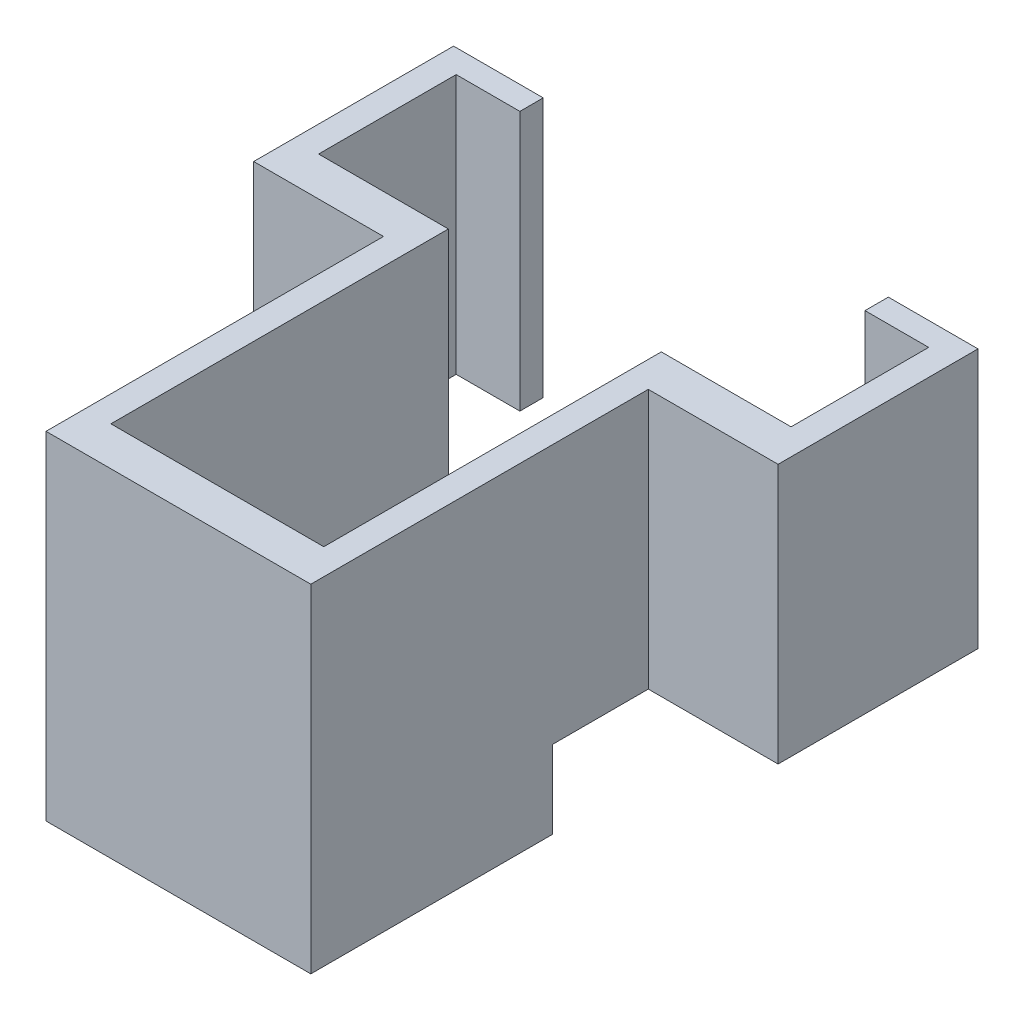
ISO-10303-21;
HEADER;
FILE_DESCRIPTION(('STEP AP214'),'2;1');
FILE_NAME('part.step','',(''),(''),'','','');
FILE_SCHEMA(('AUTOMOTIVE_DESIGN { 1 0 10303 214 1 1 1 1 }'));
ENDSEC;
DATA;
#1=APPLICATION_CONTEXT('core data for automotive mechanical design processes');
#2=APPLICATION_PROTOCOL_DEFINITION('international standard','automotive_design',2000,#1);
#3=PRODUCT_CONTEXT('',#1,'mechanical');
#4=PRODUCT('Part','Part','',(#3));
#5=PRODUCT_RELATED_PRODUCT_CATEGORY('part','',(#4));
#6=PRODUCT_DEFINITION_FORMATION('','',#4);
#7=PRODUCT_DEFINITION_CONTEXT('part definition',#1,'design');
#8=PRODUCT_DEFINITION('design','',#6,#7);
#9=PRODUCT_DEFINITION_SHAPE('','',#8);
#10=(LENGTH_UNIT() NAMED_UNIT(*) SI_UNIT(.MILLI.,.METRE.));
#11=(NAMED_UNIT(*) PLANE_ANGLE_UNIT() SI_UNIT($,.RADIAN.));
#12=(NAMED_UNIT(*) SI_UNIT($,.STERADIAN.) SOLID_ANGLE_UNIT());
#13=UNCERTAINTY_MEASURE_WITH_UNIT(LENGTH_MEASURE(1.E-05),#10,'distance_accuracy_value','');
#14=(GEOMETRIC_REPRESENTATION_CONTEXT(3) GLOBAL_UNCERTAINTY_ASSIGNED_CONTEXT((#13)) GLOBAL_UNIT_ASSIGNED_CONTEXT((#10,
#11,#12)) REPRESENTATION_CONTEXT('',''));
#15=CARTESIAN_POINT('',(0.,0.,0.));
#16=DIRECTION('',(0.,0.,1.));
#17=DIRECTION('',(1.,0.,0.));
#18=AXIS2_PLACEMENT_3D('',#15,#16,#17);
#19=CARTESIAN_POINT('',(-13.2931043324018,13.,0.));
#20=DIRECTION('',(0.,0.,-1.));
#21=DIRECTION('',(-1.,0.,0.));
#22=AXIS2_PLACEMENT_3D('',#19,#20,#21);
#23=PLANE('',#22);
#24=DIRECTION('',(0.,-1.,0.));
#25=VECTOR('',#24,1.);
#26=CARTESIAN_POINT('',(-15.7465521662009,13.,0.));
#27=LINE('',#26,#25);
#28=CARTESIAN_POINT('',(-15.7465521662009,13.,0.));
#29=VERTEX_POINT('',#28);
#30=CARTESIAN_POINT('',(-15.7465521662009,3.,0.));
#31=VERTEX_POINT('',#30);
#32=EDGE_CURVE('E310',#29,#31,#27,.T.);
#33=ORIENTED_EDGE('',*,*,#32,.T.);
#34=DIRECTION('',(1.,0.,0.));
#35=VECTOR('',#34,1.);
#36=CARTESIAN_POINT('',(-13.2931043324018,3.,0.));
#37=LINE('',#36,#35);
#38=CARTESIAN_POINT('',(-13.2931043324018,3.,0.));
#39=VERTEX_POINT('',#38);
#40=EDGE_CURVE('E472',#31,#39,#37,.T.);
#41=ORIENTED_EDGE('',*,*,#40,.T.);
#42=DIRECTION('',(0.,-1.,0.));
#43=VECTOR('',#42,1.);
#44=CARTESIAN_POINT('',(-13.2931043324018,13.,0.));
#45=LINE('',#44,#43);
#46=CARTESIAN_POINT('',(-13.2931043324018,13.,0.));
#47=VERTEX_POINT('',#46);
#48=EDGE_CURVE('E271',#47,#39,#45,.T.);
#49=ORIENTED_EDGE('',*,*,#48,.F.);
#50=DIRECTION('',(1.,0.,0.));
#51=VECTOR('',#50,1.);
#52=CARTESIAN_POINT('',(-13.2931043324018,13.,0.));
#53=LINE('',#52,#51);
#54=EDGE_CURVE('E298',#29,#47,#53,.T.);
#55=ORIENTED_EDGE('',*,*,#54,.F.);
#56=EDGE_LOOP('',(#33,#41,#49,#55));
#57=FACE_BOUND('',#56,.T.);
#58=ADVANCED_FACE('F42',(#57),#23,.F.);
#59=CARTESIAN_POINT('',(-13.2931043324018,13.,-0.899999999999998));
#60=DIRECTION('',(-1.,0.,0.));
#61=DIRECTION('',(0.,0.,1.));
#62=AXIS2_PLACEMENT_3D('',#59,#60,#61);
#63=PLANE('',#62);
#64=ORIENTED_EDGE('',*,*,#48,.T.);
#65=DIRECTION('',(0.,0.,-1.));
#66=VECTOR('',#65,1.);
#67=CARTESIAN_POINT('',(-13.2931043324018,3.,-0.899999999999998));
#68=LINE('',#67,#66);
#69=CARTESIAN_POINT('',(-13.2931043324018,3.,-0.899999999999998));
#70=VERTEX_POINT('',#69);
#71=EDGE_CURVE('E466',#39,#70,#68,.T.);
#72=ORIENTED_EDGE('',*,*,#71,.T.);
#73=DIRECTION('',(0.,-1.,0.));
#74=VECTOR('',#73,1.);
#75=CARTESIAN_POINT('',(-13.2931043324018,13.,-0.899999999999998));
#76=LINE('',#75,#74);
#77=CARTESIAN_POINT('',(-13.2931043324018,13.,-0.899999999999998));
#78=VERTEX_POINT('',#77);
#79=EDGE_CURVE('E267',#78,#70,#76,.T.);
#80=ORIENTED_EDGE('',*,*,#79,.F.);
#81=DIRECTION('',(0.,0.,-1.));
#82=VECTOR('',#81,1.);
#83=CARTESIAN_POINT('',(-13.2931043324018,13.,-0.899999999999998));
#84=LINE('',#83,#82);
#85=EDGE_CURVE('E304',#47,#78,#84,.T.);
#86=ORIENTED_EDGE('',*,*,#85,.F.);
#87=EDGE_LOOP('',(#64,#72,#80,#86));
#88=FACE_BOUND('',#87,.T.);
#89=ADVANCED_FACE('F513',(#88),#63,.F.);
#90=CARTESIAN_POINT('',(-13.2931043324018,13.,-0.899999999999998));
#91=DIRECTION('',(0.,0.,1.));
#92=DIRECTION('',(1.,0.,0.));
#93=AXIS2_PLACEMENT_3D('',#90,#91,#92);
#94=PLANE('',#93);
#95=ORIENTED_EDGE('',*,*,#79,.T.);
#96=DIRECTION('',(-1.,0.,0.));
#97=VECTOR('',#96,1.);
#98=CARTESIAN_POINT('',(3.45344783379909,3.,-0.899999999999998));
#99=LINE('',#98,#97);
#100=CARTESIAN_POINT('',(-16.7465521662009,3.,-0.899999999999998));
#101=VERTEX_POINT('',#100);
#102=EDGE_CURVE('E217',#70,#101,#99,.T.);
#103=ORIENTED_EDGE('',*,*,#102,.T.);
#104=DIRECTION('',(0.,-1.,0.));
#105=VECTOR('',#104,1.);
#106=CARTESIAN_POINT('',(-16.7465521662009,13.,-0.899999999999998));
#107=LINE('',#106,#105);
#108=CARTESIAN_POINT('',(-16.7465521662009,13.,-0.899999999999998));
#109=VERTEX_POINT('',#108);
#110=EDGE_CURVE('E263',#109,#101,#107,.T.);
#111=ORIENTED_EDGE('',*,*,#110,.F.);
#112=DIRECTION('',(-1.,0.,0.));
#113=VECTOR('',#112,1.);
#114=CARTESIAN_POINT('',(-13.2931043324018,13.,-0.899999999999998));
#115=LINE('',#114,#113);
#116=EDGE_CURVE('E382',#78,#109,#115,.T.);
#117=ORIENTED_EDGE('',*,*,#116,.F.);
#118=EDGE_LOOP('',(#95,#103,#111,#117));
#119=FACE_BOUND('',#118,.T.);
#120=ADVANCED_FACE('F501',(#119),#94,.F.);
#121=CARTESIAN_POINT('',(-16.7465521662009,13.,-0.899999999999998));
#122=DIRECTION('',(1.,0.,0.));
#123=DIRECTION('',(0.,0.,-1.));
#124=AXIS2_PLACEMENT_3D('',#121,#122,#123);
#125=PLANE('',#124);
#126=ORIENTED_EDGE('',*,*,#110,.T.);
#127=DIRECTION('',(0.,0.,1.));
#128=VECTOR('',#127,1.);
#129=CARTESIAN_POINT('',(-16.7465521662009,3.,-0.899999999999998));
#130=LINE('',#129,#128);
#131=CARTESIAN_POINT('',(-16.7465521662009,3.,6.8));
#132=VERTEX_POINT('',#131);
#133=EDGE_CURVE('E376',#101,#132,#130,.T.);
#134=ORIENTED_EDGE('',*,*,#133,.T.);
#135=DIRECTION('',(0.,-1.,0.));
#136=VECTOR('',#135,1.);
#137=CARTESIAN_POINT('',(-16.7465521662009,13.,6.8));
#138=LINE('',#137,#136);
#139=CARTESIAN_POINT('',(-16.7465521662009,13.,6.8));
#140=VERTEX_POINT('',#139);
#141=EDGE_CURVE('E259',#140,#132,#138,.T.);
#142=ORIENTED_EDGE('',*,*,#141,.F.);
#143=DIRECTION('',(0.,0.,1.));
#144=VECTOR('',#143,1.);
#145=CARTESIAN_POINT('',(-16.7465521662009,13.,-0.899999999999998));
#146=LINE('',#145,#144);
#147=EDGE_CURVE('E385',#109,#140,#146,.T.);
#148=ORIENTED_EDGE('',*,*,#147,.F.);
#149=EDGE_LOOP('',(#126,#134,#142,#148));
#150=FACE_BOUND('',#149,.T.);
#151=ADVANCED_FACE('F506',(#150),#125,.F.);
#152=CARTESIAN_POINT('',(-16.7465521662009,13.,6.8));
#153=DIRECTION('',(0.,0.,-1.));
#154=DIRECTION('',(-1.,0.,0.));
#155=AXIS2_PLACEMENT_3D('',#152,#153,#154);
#156=PLANE('',#155);
#157=ORIENTED_EDGE('',*,*,#141,.T.);
#158=DIRECTION('',(1.,0.,0.));
#159=VECTOR('',#158,1.);
#160=CARTESIAN_POINT('',(-16.7465521662009,3.,6.8));
#161=LINE('',#160,#159);
#162=CARTESIAN_POINT('',(-11.7465521662009,3.,6.8));
#163=VERTEX_POINT('',#162);
#164=EDGE_CURVE('E372',#132,#163,#161,.T.);
#165=ORIENTED_EDGE('',*,*,#164,.T.);
#166=DIRECTION('',(0.,-1.,0.));
#167=VECTOR('',#166,1.);
#168=CARTESIAN_POINT('',(-11.7465521662009,13.,6.8));
#169=LINE('',#168,#167);
#170=CARTESIAN_POINT('',(-11.7465521662009,13.,6.8));
#171=VERTEX_POINT('',#170);
#172=EDGE_CURVE('E255',#171,#163,#169,.T.);
#173=ORIENTED_EDGE('',*,*,#172,.F.);
#174=DIRECTION('',(1.,0.,0.));
#175=VECTOR('',#174,1.);
#176=CARTESIAN_POINT('',(-16.7465521662009,13.,6.8));
#177=LINE('',#176,#175);
#178=EDGE_CURVE('E388',#140,#171,#177,.T.);
#179=ORIENTED_EDGE('',*,*,#178,.F.);
#180=EDGE_LOOP('',(#157,#165,#173,#179));
#181=FACE_BOUND('',#180,.T.);
#182=ADVANCED_FACE('F530',(#181),#156,.F.);
#183=CARTESIAN_POINT('',(-11.7465521662009,13.,6.8));
#184=DIRECTION('',(1.,0.,0.));
#185=DIRECTION('',(0.,0.,-1.));
#186=AXIS2_PLACEMENT_3D('',#183,#184,#185);
#187=PLANE('',#186);
#188=ORIENTED_EDGE('',*,*,#172,.T.);
#189=DIRECTION('',(0.,0.,1.));
#190=VECTOR('',#189,1.);
#191=CARTESIAN_POINT('',(-11.7465521662009,3.,6.8));
#192=LINE('',#191,#190);
#193=CARTESIAN_POINT('',(-11.7465521662009,3.,10.4858867658342));
#194=VERTEX_POINT('',#193);
#195=EDGE_CURVE('E368',#163,#194,#192,.T.);
#196=ORIENTED_EDGE('',*,*,#195,.T.);
#197=DIRECTION('',(0.,-1.,0.));
#198=VECTOR('',#197,1.);
#199=CARTESIAN_POINT('',(-11.7465521662009,13.,10.4858867658342));
#200=LINE('',#199,#198);
#201=CARTESIAN_POINT('',(-11.7465521662009,0.,10.4858867658342));
#202=VERTEX_POINT('',#201);
#203=EDGE_CURVE('E483',#194,#202,#200,.T.);
#204=ORIENTED_EDGE('',*,*,#203,.T.);
#205=DIRECTION('',(0.,0.,1.));
#206=VECTOR('',#205,1.);
#207=CARTESIAN_POINT('',(-11.7465521662009,0.,6.8));
#208=LINE('',#207,#206);
#209=CARTESIAN_POINT('',(-11.7465521662009,0.,19.8));
#210=VERTEX_POINT('',#209);
#211=EDGE_CURVE('E288',#202,#210,#208,.T.);
#212=ORIENTED_EDGE('',*,*,#211,.T.);
#213=DIRECTION('',(0.,-1.,0.));
#214=VECTOR('',#213,1.);
#215=CARTESIAN_POINT('',(-11.7465521662009,13.,19.8));
#216=LINE('',#215,#214);
#217=CARTESIAN_POINT('',(-11.7465521662009,13.,19.8));
#218=VERTEX_POINT('',#217);
#219=EDGE_CURVE('E251',#218,#210,#216,.T.);
#220=ORIENTED_EDGE('',*,*,#219,.F.);
#221=DIRECTION('',(0.,0.,1.));
#222=VECTOR('',#221,1.);
#223=CARTESIAN_POINT('',(-11.7465521662009,13.,6.8));
#224=LINE('',#223,#222);
#225=EDGE_CURVE('E391',#171,#218,#224,.T.);
#226=ORIENTED_EDGE('',*,*,#225,.F.);
#227=EDGE_LOOP('',(#188,#196,#204,#212,#220,#226));
#228=FACE_BOUND('',#227,.T.);
#229=ADVANCED_FACE('F526',(#228),#187,.F.);
#230=CARTESIAN_POINT('',(-11.7465521662009,13.,19.8));
#231=DIRECTION('',(0.,0.,-1.));
#232=DIRECTION('',(-1.,0.,0.));
#233=AXIS2_PLACEMENT_3D('',#230,#231,#232);
#234=PLANE('',#233);
#235=DIRECTION('',(1.,0.,0.));
#236=VECTOR('',#235,1.);
#237=CARTESIAN_POINT('',(-11.7465521662009,0.,19.8));
#238=LINE('',#237,#236);
#239=CARTESIAN_POINT('',(-1.54655216620091,0.,19.8));
#240=VERTEX_POINT('',#239);
#241=EDGE_CURVE('E434',#210,#240,#238,.T.);
#242=ORIENTED_EDGE('',*,*,#241,.T.);
#243=DIRECTION('',(0.,-1.,0.));
#244=VECTOR('',#243,1.);
#245=CARTESIAN_POINT('',(-1.54655216620091,13.,19.8));
#246=LINE('',#245,#244);
#247=CARTESIAN_POINT('',(-1.54655216620091,13.,19.8));
#248=VERTEX_POINT('',#247);
#249=EDGE_CURVE('E247',#248,#240,#246,.T.);
#250=ORIENTED_EDGE('',*,*,#249,.F.);
#251=DIRECTION('',(1.,0.,0.));
#252=VECTOR('',#251,1.);
#253=CARTESIAN_POINT('',(-11.7465521662009,13.,19.8));
#254=LINE('',#253,#252);
#255=EDGE_CURVE('E394',#218,#248,#254,.T.);
#256=ORIENTED_EDGE('',*,*,#255,.F.);
#257=ORIENTED_EDGE('',*,*,#219,.T.);
#258=EDGE_LOOP('',(#242,#250,#256,#257));
#259=FACE_BOUND('',#258,.T.);
#260=ADVANCED_FACE('F536',(#259),#234,.F.);
#261=CARTESIAN_POINT('',(-1.54655216620091,13.,19.8));
#262=DIRECTION('',(-1.,0.,0.));
#263=DIRECTION('',(0.,0.,1.));
#264=AXIS2_PLACEMENT_3D('',#261,#262,#263);
#265=PLANE('',#264);
#266=DIRECTION('',(0.,1.,0.));
#267=VECTOR('',#266,1.);
#268=CARTESIAN_POINT('',(-1.54655216620091,13.,10.4858867658342));
#269=LINE('',#268,#267);
#270=CARTESIAN_POINT('',(-1.54655216620091,0.,10.4858867658342));
#271=VERTEX_POINT('',#270);
#272=CARTESIAN_POINT('',(-1.54655216620091,3.,10.4858867658342));
#273=VERTEX_POINT('',#272);
#274=EDGE_CURVE('E57',#271,#273,#269,.T.);
#275=ORIENTED_EDGE('',*,*,#274,.T.);
#276=DIRECTION('',(0.,0.,-1.));
#277=VECTOR('',#276,1.);
#278=CARTESIAN_POINT('',(-1.54655216620091,3.,19.8));
#279=LINE('',#278,#277);
#280=CARTESIAN_POINT('',(-1.54655216620091,3.,6.8));
#281=VERTEX_POINT('',#280);
#282=EDGE_CURVE('E359',#273,#281,#279,.T.);
#283=ORIENTED_EDGE('',*,*,#282,.T.);
#284=DIRECTION('',(0.,-1.,0.));
#285=VECTOR('',#284,1.);
#286=CARTESIAN_POINT('',(-1.54655216620091,13.,6.8));
#287=LINE('',#286,#285);
#288=CARTESIAN_POINT('',(-1.54655216620091,13.,6.8));
#289=VERTEX_POINT('',#288);
#290=EDGE_CURVE('E238',#289,#281,#287,.T.);
#291=ORIENTED_EDGE('',*,*,#290,.F.);
#292=DIRECTION('',(0.,0.,-1.));
#293=VECTOR('',#292,1.);
#294=CARTESIAN_POINT('',(-1.54655216620091,13.,19.8));
#295=LINE('',#294,#293);
#296=EDGE_CURVE('E397',#248,#289,#295,.T.);
#297=ORIENTED_EDGE('',*,*,#296,.F.);
#298=ORIENTED_EDGE('',*,*,#249,.T.);
#299=DIRECTION('',(0.,0.,-1.));
#300=VECTOR('',#299,1.);
#301=CARTESIAN_POINT('',(-1.54655216620091,0.,19.8));
#302=LINE('',#301,#300);
#303=EDGE_CURVE('E437',#240,#271,#302,.T.);
#304=ORIENTED_EDGE('',*,*,#303,.T.);
#305=EDGE_LOOP('',(#275,#283,#291,#297,#298,#304));
#306=FACE_BOUND('',#305,.T.);
#307=ADVANCED_FACE('F538',(#306),#265,.F.);
#308=CARTESIAN_POINT('',(-1.54655216620091,13.,6.8));
#309=DIRECTION('',(0.,0.,-1.));
#310=DIRECTION('',(-1.,0.,0.));
#311=AXIS2_PLACEMENT_3D('',#308,#309,#310);
#312=PLANE('',#311);
#313=ORIENTED_EDGE('',*,*,#290,.T.);
#314=DIRECTION('',(1.,0.,0.));
#315=VECTOR('',#314,1.);
#316=CARTESIAN_POINT('',(-1.54655216620091,3.,6.8));
#317=LINE('',#316,#315);
#318=CARTESIAN_POINT('',(3.45344783379909,3.,6.8));
#319=VERTEX_POINT('',#318);
#320=EDGE_CURVE('E355',#281,#319,#317,.T.);
#321=ORIENTED_EDGE('',*,*,#320,.T.);
#322=DIRECTION('',(0.,-1.,0.));
#323=VECTOR('',#322,1.);
#324=CARTESIAN_POINT('',(3.45344783379909,13.,6.8));
#325=LINE('',#324,#323);
#326=CARTESIAN_POINT('',(3.45344783379909,13.,6.8));
#327=VERTEX_POINT('',#326);
#328=EDGE_CURVE('E227',#327,#319,#325,.T.);
#329=ORIENTED_EDGE('',*,*,#328,.F.);
#330=DIRECTION('',(1.,0.,0.));
#331=VECTOR('',#330,1.);
#332=CARTESIAN_POINT('',(-1.54655216620091,13.,6.8));
#333=LINE('',#332,#331);
#334=EDGE_CURVE('E400',#289,#327,#333,.T.);
#335=ORIENTED_EDGE('',*,*,#334,.F.);
#336=EDGE_LOOP('',(#313,#321,#329,#335));
#337=FACE_BOUND('',#336,.T.);
#338=ADVANCED_FACE('F541',(#337),#312,.F.);
#339=CARTESIAN_POINT('',(3.45344783379909,13.,6.8));
#340=DIRECTION('',(-1.,0.,0.));
#341=DIRECTION('',(0.,0.,1.));
#342=AXIS2_PLACEMENT_3D('',#339,#340,#341);
#343=PLANE('',#342);
#344=ORIENTED_EDGE('',*,*,#328,.T.);
#345=DIRECTION('',(0.,0.,-1.));
#346=VECTOR('',#345,1.);
#347=CARTESIAN_POINT('',(3.45344783379909,3.,-0.899999999999998));
#348=LINE('',#347,#346);
#349=CARTESIAN_POINT('',(3.45344783379909,3.,-0.899999999999998));
#350=VERTEX_POINT('',#349);
#351=EDGE_CURVE('E208',#319,#350,#348,.T.);
#352=ORIENTED_EDGE('',*,*,#351,.T.);
#353=DIRECTION('',(0.,-1.,0.));
#354=VECTOR('',#353,1.);
#355=CARTESIAN_POINT('',(3.45344783379909,13.,-0.9));
#356=LINE('',#355,#354);
#357=CARTESIAN_POINT('',(3.45344783379909,13.,-0.9));
#358=VERTEX_POINT('',#357);
#359=EDGE_CURVE('E224',#358,#350,#356,.T.);
#360=ORIENTED_EDGE('',*,*,#359,.F.);
#361=DIRECTION('',(0.,0.,-1.));
#362=VECTOR('',#361,1.);
#363=CARTESIAN_POINT('',(3.45344783379909,13.,6.8));
#364=LINE('',#363,#362);
#365=EDGE_CURVE('E403',#327,#358,#364,.T.);
#366=ORIENTED_EDGE('',*,*,#365,.F.);
#367=EDGE_LOOP('',(#344,#352,#360,#366));
#368=FACE_BOUND('',#367,.T.);
#369=ADVANCED_FACE('F222',(#368),#343,.F.);
#370=CARTESIAN_POINT('',(3.45344783379909,13.,-0.9));
#371=DIRECTION('',(0.,0.,1.));
#372=DIRECTION('',(1.,0.,0.));
#373=AXIS2_PLACEMENT_3D('',#370,#371,#372);
#374=PLANE('',#373);
#375=ORIENTED_EDGE('',*,*,#359,.T.);
#376=CARTESIAN_POINT('',(0.,3.,-0.899999999999998));
#377=VERTEX_POINT('',#376);
#378=EDGE_CURVE('E204',#350,#377,#99,.T.);
#379=ORIENTED_EDGE('',*,*,#378,.T.);
#380=DIRECTION('',(0.,-1.,0.));
#381=VECTOR('',#380,1.);
#382=CARTESIAN_POINT('',(0.,13.,-0.9));
#383=LINE('',#382,#381);
#384=CARTESIAN_POINT('',(0.,13.,-0.9));
#385=VERTEX_POINT('',#384);
#386=EDGE_CURVE('E234',#385,#377,#383,.T.);
#387=ORIENTED_EDGE('',*,*,#386,.F.);
#388=DIRECTION('',(-1.,0.,0.));
#389=VECTOR('',#388,1.);
#390=CARTESIAN_POINT('',(3.45344783379909,13.,-0.9));
#391=LINE('',#390,#389);
#392=EDGE_CURVE('E232',#358,#385,#391,.T.);
#393=ORIENTED_EDGE('',*,*,#392,.F.);
#394=EDGE_LOOP('',(#375,#379,#387,#393));
#395=FACE_BOUND('',#394,.T.);
#396=ADVANCED_FACE('F231',(#395),#374,.F.);
#397=CARTESIAN_POINT('',(0.,13.,0.));
#398=DIRECTION('',(1.,0.,0.));
#399=DIRECTION('',(0.,0.,-1.));
#400=AXIS2_PLACEMENT_3D('',#397,#398,#399);
#401=PLANE('',#400);
#402=ORIENTED_EDGE('',*,*,#386,.T.);
#403=DIRECTION('',(0.,0.,1.));
#404=VECTOR('',#403,1.);
#405=CARTESIAN_POINT('',(0.,3.,0.));
#406=LINE('',#405,#404);
#407=CARTESIAN_POINT('',(0.,3.,0.));
#408=VERTEX_POINT('',#407);
#409=EDGE_CURVE('E211',#377,#408,#406,.T.);
#410=ORIENTED_EDGE('',*,*,#409,.T.);
#411=DIRECTION('',(0.,-1.,0.));
#412=VECTOR('',#411,1.);
#413=CARTESIAN_POINT('',(0.,13.,0.));
#414=LINE('',#413,#412);
#415=CARTESIAN_POINT('',(0.,13.,0.));
#416=VERTEX_POINT('',#415);
#417=EDGE_CURVE('E240',#416,#408,#414,.T.);
#418=ORIENTED_EDGE('',*,*,#417,.F.);
#419=DIRECTION('',(0.,0.,1.));
#420=VECTOR('',#419,1.);
#421=CARTESIAN_POINT('',(0.,13.,0.));
#422=LINE('',#421,#420);
#423=EDGE_CURVE('E353',#385,#416,#422,.T.);
#424=ORIENTED_EDGE('',*,*,#423,.F.);
#425=EDGE_LOOP('',(#402,#410,#418,#424));
#426=FACE_BOUND('',#425,.T.);
#427=ADVANCED_FACE('F352',(#426),#401,.F.);
#428=CARTESIAN_POINT('',(2.45344783379909,13.,0.));
#429=DIRECTION('',(0.,0.,-1.));
#430=DIRECTION('',(-1.,0.,0.));
#431=AXIS2_PLACEMENT_3D('',#428,#429,#430);
#432=PLANE('',#431);
#433=ORIENTED_EDGE('',*,*,#417,.T.);
#434=DIRECTION('',(1.,0.,0.));
#435=VECTOR('',#434,1.);
#436=CARTESIAN_POINT('',(2.45344783379909,3.,0.));
#437=LINE('',#436,#435);
#438=CARTESIAN_POINT('',(2.45344783379909,3.,0.));
#439=VERTEX_POINT('',#438);
#440=EDGE_CURVE('E348',#408,#439,#437,.T.);
#441=ORIENTED_EDGE('',*,*,#440,.T.);
#442=DIRECTION('',(0.,-1.,0.));
#443=VECTOR('',#442,1.);
#444=CARTESIAN_POINT('',(2.45344783379909,13.,0.));
#445=LINE('',#444,#443);
#446=CARTESIAN_POINT('',(2.45344783379909,13.,0.));
#447=VERTEX_POINT('',#446);
#448=EDGE_CURVE('E337',#447,#439,#445,.T.);
#449=ORIENTED_EDGE('',*,*,#448,.F.);
#450=DIRECTION('',(1.,0.,0.));
#451=VECTOR('',#450,1.);
#452=CARTESIAN_POINT('',(2.45344783379909,13.,0.));
#453=LINE('',#452,#451);
#454=EDGE_CURVE('E349',#416,#447,#453,.T.);
#455=ORIENTED_EDGE('',*,*,#454,.F.);
#456=EDGE_LOOP('',(#433,#441,#449,#455));
#457=FACE_BOUND('',#456,.T.);
#458=ADVANCED_FACE('F346',(#457),#432,.F.);
#459=CARTESIAN_POINT('',(2.45344783379909,13.,5.3));
#460=DIRECTION('',(1.,0.,0.));
#461=DIRECTION('',(0.,0.,-1.));
#462=AXIS2_PLACEMENT_3D('',#459,#460,#461);
#463=PLANE('',#462);
#464=ORIENTED_EDGE('',*,*,#448,.T.);
#465=DIRECTION('',(0.,0.,1.));
#466=VECTOR('',#465,1.);
#467=CARTESIAN_POINT('',(2.45344783379909,3.,5.3));
#468=LINE('',#467,#466);
#469=CARTESIAN_POINT('',(2.45344783379909,3.,5.3));
#470=VERTEX_POINT('',#469);
#471=EDGE_CURVE('E361',#439,#470,#468,.T.);
#472=ORIENTED_EDGE('',*,*,#471,.T.);
#473=DIRECTION('',(0.,-1.,0.));
#474=VECTOR('',#473,1.);
#475=CARTESIAN_POINT('',(2.45344783379909,13.,5.3));
#476=LINE('',#475,#474);
#477=CARTESIAN_POINT('',(2.45344783379909,13.,5.3));
#478=VERTEX_POINT('',#477);
#479=EDGE_CURVE('E333',#478,#470,#476,.T.);
#480=ORIENTED_EDGE('',*,*,#479,.F.);
#481=DIRECTION('',(0.,0.,1.));
#482=VECTOR('',#481,1.);
#483=CARTESIAN_POINT('',(2.45344783379909,13.,5.3));
#484=LINE('',#483,#482);
#485=EDGE_CURVE('E412',#447,#478,#484,.T.);
#486=ORIENTED_EDGE('',*,*,#485,.F.);
#487=EDGE_LOOP('',(#464,#472,#480,#486));
#488=FACE_BOUND('',#487,.T.);
#489=ADVANCED_FACE('F544',(#488),#463,.F.);
#490=CARTESIAN_POINT('',(2.45344783379909,13.,5.3));
#491=DIRECTION('',(0.,0.,1.));
#492=DIRECTION('',(1.,0.,0.));
#493=AXIS2_PLACEMENT_3D('',#490,#491,#492);
#494=PLANE('',#493);
#495=ORIENTED_EDGE('',*,*,#479,.T.);
#496=DIRECTION('',(-1.,0.,0.));
#497=VECTOR('',#496,1.);
#498=CARTESIAN_POINT('',(2.45344783379909,3.,5.3));
#499=LINE('',#498,#497);
#500=CARTESIAN_POINT('',(-2.54655216620091,3.,5.3));
#501=VERTEX_POINT('',#500);
#502=EDGE_CURVE('E459',#470,#501,#499,.T.);
#503=ORIENTED_EDGE('',*,*,#502,.T.);
#504=DIRECTION('',(0.,-1.,0.));
#505=VECTOR('',#504,1.);
#506=CARTESIAN_POINT('',(-2.54655216620091,13.,5.3));
#507=LINE('',#506,#505);
#508=CARTESIAN_POINT('',(-2.54655216620091,13.,5.3));
#509=VERTEX_POINT('',#508);
#510=EDGE_CURVE('E329',#509,#501,#507,.T.);
#511=ORIENTED_EDGE('',*,*,#510,.F.);
#512=DIRECTION('',(-1.,0.,0.));
#513=VECTOR('',#512,1.);
#514=CARTESIAN_POINT('',(2.45344783379909,13.,5.3));
#515=LINE('',#514,#513);
#516=EDGE_CURVE('E415',#478,#509,#515,.T.);
#517=ORIENTED_EDGE('',*,*,#516,.F.);
#518=EDGE_LOOP('',(#495,#503,#511,#517));
#519=FACE_BOUND('',#518,.T.);
#520=ADVANCED_FACE('F458',(#519),#494,.F.);
#521=CARTESIAN_POINT('',(-2.54655216620091,13.,5.3));
#522=DIRECTION('',(1.,0.,0.));
#523=DIRECTION('',(0.,0.,-1.));
#524=AXIS2_PLACEMENT_3D('',#521,#522,#523);
#525=PLANE('',#524);
#526=ORIENTED_EDGE('',*,*,#510,.T.);
#527=DIRECTION('',(0.,0.,1.));
#528=VECTOR('',#527,1.);
#529=CARTESIAN_POINT('',(-2.54655216620091,3.,5.3));
#530=LINE('',#529,#528);
#531=CARTESIAN_POINT('',(-2.54655216620091,3.,10.4858867658342));
#532=VERTEX_POINT('',#531);
#533=EDGE_CURVE('E455',#501,#532,#530,.T.);
#534=ORIENTED_EDGE('',*,*,#533,.T.);
#535=DIRECTION('',(0.,-1.,0.));
#536=VECTOR('',#535,1.);
#537=CARTESIAN_POINT('',(-2.54655216620091,13.,10.4858867658342));
#538=LINE('',#537,#536);
#539=CARTESIAN_POINT('',(-2.54655216620091,0.,10.4858867658342));
#540=VERTEX_POINT('',#539);
#541=EDGE_CURVE('E447',#532,#540,#538,.T.);
#542=ORIENTED_EDGE('',*,*,#541,.T.);
#543=DIRECTION('',(0.,0.,1.));
#544=VECTOR('',#543,1.);
#545=CARTESIAN_POINT('',(-2.54655216620091,0.,5.3));
#546=LINE('',#545,#544);
#547=CARTESIAN_POINT('',(-2.54655216620091,0.,18.3));
#548=VERTEX_POINT('',#547);
#549=EDGE_CURVE('E306',#540,#548,#546,.T.);
#550=ORIENTED_EDGE('',*,*,#549,.T.);
#551=DIRECTION('',(0.,-1.,0.));
#552=VECTOR('',#551,1.);
#553=CARTESIAN_POINT('',(-2.54655216620091,13.,18.3));
#554=LINE('',#553,#552);
#555=CARTESIAN_POINT('',(-2.54655216620091,13.,18.3));
#556=VERTEX_POINT('',#555);
#557=EDGE_CURVE('E325',#556,#548,#554,.T.);
#558=ORIENTED_EDGE('',*,*,#557,.F.);
#559=DIRECTION('',(0.,0.,1.));
#560=VECTOR('',#559,1.);
#561=CARTESIAN_POINT('',(-2.54655216620091,13.,5.3));
#562=LINE('',#561,#560);
#563=EDGE_CURVE('E418',#509,#556,#562,.T.);
#564=ORIENTED_EDGE('',*,*,#563,.F.);
#565=EDGE_LOOP('',(#526,#534,#542,#550,#558,#564));
#566=FACE_BOUND('',#565,.T.);
#567=ADVANCED_FACE('F443',(#566),#525,.F.);
#568=CARTESIAN_POINT('',(-2.54655216620091,13.,18.3));
#569=DIRECTION('',(0.,0.,1.));
#570=DIRECTION('',(1.,0.,0.));
#571=AXIS2_PLACEMENT_3D('',#568,#569,#570);
#572=PLANE('',#571);
#573=DIRECTION('',(-1.,0.,0.));
#574=VECTOR('',#573,1.);
#575=CARTESIAN_POINT('',(-2.54655216620091,0.,18.3));
#576=LINE('',#575,#574);
#577=CARTESIAN_POINT('',(-10.7465521662009,0.,18.3));
#578=VERTEX_POINT('',#577);
#579=EDGE_CURVE('E299',#548,#578,#576,.T.);
#580=ORIENTED_EDGE('',*,*,#579,.T.);
#581=DIRECTION('',(0.,-1.,0.));
#582=VECTOR('',#581,1.);
#583=CARTESIAN_POINT('',(-10.7465521662009,13.,18.3));
#584=LINE('',#583,#582);
#585=CARTESIAN_POINT('',(-10.7465521662009,13.,18.3));
#586=VERTEX_POINT('',#585);
#587=EDGE_CURVE('E296',#586,#578,#584,.T.);
#588=ORIENTED_EDGE('',*,*,#587,.F.);
#589=DIRECTION('',(-1.,0.,0.));
#590=VECTOR('',#589,1.);
#591=CARTESIAN_POINT('',(-2.54655216620091,13.,18.3));
#592=LINE('',#591,#590);
#593=EDGE_CURVE('E421',#556,#586,#592,.T.);
#594=ORIENTED_EDGE('',*,*,#593,.F.);
#595=ORIENTED_EDGE('',*,*,#557,.T.);
#596=EDGE_LOOP('',(#580,#588,#594,#595));
#597=FACE_BOUND('',#596,.T.);
#598=ADVANCED_FACE('F449',(#597),#572,.F.);
#599=CARTESIAN_POINT('',(-10.7465521662009,13.,18.3));
#600=DIRECTION('',(-1.,0.,0.));
#601=DIRECTION('',(0.,0.,1.));
#602=AXIS2_PLACEMENT_3D('',#599,#600,#601);
#603=PLANE('',#602);
#604=DIRECTION('',(0.,1.,0.));
#605=VECTOR('',#604,1.);
#606=CARTESIAN_POINT('',(-10.7465521662009,13.,10.4858867658342));
#607=LINE('',#606,#605);
#608=CARTESIAN_POINT('',(-10.7465521662009,0.,10.4858867658342));
#609=VERTEX_POINT('',#608);
#610=CARTESIAN_POINT('',(-10.7465521662009,3.,10.4858867658342));
#611=VERTEX_POINT('',#610);
#612=EDGE_CURVE('E65',#609,#611,#607,.T.);
#613=ORIENTED_EDGE('',*,*,#612,.T.);
#614=DIRECTION('',(0.,0.,-1.));
#615=VECTOR('',#614,1.);
#616=CARTESIAN_POINT('',(-10.7465521662009,3.,18.3));
#617=LINE('',#616,#615);
#618=CARTESIAN_POINT('',(-10.7465521662009,3.,5.3));
#619=VERTEX_POINT('',#618);
#620=EDGE_CURVE('E476',#611,#619,#617,.T.);
#621=ORIENTED_EDGE('',*,*,#620,.T.);
#622=DIRECTION('',(0.,-1.,0.));
#623=VECTOR('',#622,1.);
#624=CARTESIAN_POINT('',(-10.7465521662009,13.,5.3));
#625=LINE('',#624,#623);
#626=CARTESIAN_POINT('',(-10.7465521662009,13.,5.3));
#627=VERTEX_POINT('',#626);
#628=EDGE_CURVE('E319',#627,#619,#625,.T.);
#629=ORIENTED_EDGE('',*,*,#628,.F.);
#630=DIRECTION('',(0.,0.,-1.));
#631=VECTOR('',#630,1.);
#632=CARTESIAN_POINT('',(-10.7465521662009,13.,18.3));
#633=LINE('',#632,#631);
#634=EDGE_CURVE('E424',#586,#627,#633,.T.);
#635=ORIENTED_EDGE('',*,*,#634,.F.);
#636=ORIENTED_EDGE('',*,*,#587,.T.);
#637=DIRECTION('',(0.,0.,-1.));
#638=VECTOR('',#637,1.);
#639=CARTESIAN_POINT('',(-10.7465521662009,0.,18.3));
#640=LINE('',#639,#638);
#641=EDGE_CURVE('E286',#578,#609,#640,.T.);
#642=ORIENTED_EDGE('',*,*,#641,.T.);
#643=EDGE_LOOP('',(#613,#621,#629,#635,#636,#642));
#644=FACE_BOUND('',#643,.T.);
#645=ADVANCED_FACE('F292',(#644),#603,.F.);
#646=CARTESIAN_POINT('',(-10.7465521662009,13.,5.3));
#647=DIRECTION('',(0.,0.,1.));
#648=DIRECTION('',(1.,0.,0.));
#649=AXIS2_PLACEMENT_3D('',#646,#647,#648);
#650=PLANE('',#649);
#651=ORIENTED_EDGE('',*,*,#628,.T.);
#652=DIRECTION('',(-1.,0.,0.));
#653=VECTOR('',#652,1.);
#654=CARTESIAN_POINT('',(-10.7465521662009,3.,5.3));
#655=LINE('',#654,#653);
#656=CARTESIAN_POINT('',(-15.7465521662009,3.,5.3));
#657=VERTEX_POINT('',#656);
#658=EDGE_CURVE('E479',#619,#657,#655,.T.);
#659=ORIENTED_EDGE('',*,*,#658,.T.);
#660=DIRECTION('',(0.,-1.,0.));
#661=VECTOR('',#660,1.);
#662=CARTESIAN_POINT('',(-15.7465521662009,13.,5.3));
#663=LINE('',#662,#661);
#664=CARTESIAN_POINT('',(-15.7465521662009,13.,5.3));
#665=VERTEX_POINT('',#664);
#666=EDGE_CURVE('E314',#665,#657,#663,.T.);
#667=ORIENTED_EDGE('',*,*,#666,.F.);
#668=DIRECTION('',(-1.,0.,0.));
#669=VECTOR('',#668,1.);
#670=CARTESIAN_POINT('',(-10.7465521662009,13.,5.3));
#671=LINE('',#670,#669);
#672=EDGE_CURVE('E427',#627,#665,#671,.T.);
#673=ORIENTED_EDGE('',*,*,#672,.F.);
#674=EDGE_LOOP('',(#651,#659,#667,#673));
#675=FACE_BOUND('',#674,.T.);
#676=ADVANCED_FACE('F522',(#675),#650,.F.);
#677=CARTESIAN_POINT('',(-15.7465521662009,13.,0.));
#678=DIRECTION('',(-1.,0.,0.));
#679=DIRECTION('',(0.,0.,1.));
#680=AXIS2_PLACEMENT_3D('',#677,#678,#679);
#681=PLANE('',#680);
#682=ORIENTED_EDGE('',*,*,#666,.T.);
#683=DIRECTION('',(0.,0.,-1.));
#684=VECTOR('',#683,1.);
#685=CARTESIAN_POINT('',(-15.7465521662009,3.,0.));
#686=LINE('',#685,#684);
#687=EDGE_CURVE('E11',#657,#31,#686,.T.);
#688=ORIENTED_EDGE('',*,*,#687,.T.);
#689=ORIENTED_EDGE('',*,*,#32,.F.);
#690=DIRECTION('',(0.,0.,-1.));
#691=VECTOR('',#690,1.);
#692=CARTESIAN_POINT('',(-15.7465521662009,13.,0.));
#693=LINE('',#692,#691);
#694=EDGE_CURVE('E315',#665,#29,#693,.T.);
#695=ORIENTED_EDGE('',*,*,#694,.F.);
#696=EDGE_LOOP('',(#682,#688,#689,#695));
#697=FACE_BOUND('',#696,.T.);
#698=ADVANCED_FACE('F519',(#697),#681,.F.);
#699=CARTESIAN_POINT('',(0.,13.,0.));
#700=DIRECTION('',(0.,1.,0.));
#701=DIRECTION('',(0.,0.,1.));
#702=AXIS2_PLACEMENT_3D('',#699,#700,#701);
#703=PLANE('',#702);
#704=ORIENTED_EDGE('',*,*,#54,.T.);
#705=ORIENTED_EDGE('',*,*,#85,.T.);
#706=ORIENTED_EDGE('',*,*,#116,.T.);
#707=ORIENTED_EDGE('',*,*,#147,.T.);
#708=ORIENTED_EDGE('',*,*,#178,.T.);
#709=ORIENTED_EDGE('',*,*,#225,.T.);
#710=ORIENTED_EDGE('',*,*,#255,.T.);
#711=ORIENTED_EDGE('',*,*,#296,.T.);
#712=ORIENTED_EDGE('',*,*,#334,.T.);
#713=ORIENTED_EDGE('',*,*,#365,.T.);
#714=ORIENTED_EDGE('',*,*,#392,.T.);
#715=ORIENTED_EDGE('',*,*,#423,.T.);
#716=ORIENTED_EDGE('',*,*,#454,.T.);
#717=ORIENTED_EDGE('',*,*,#485,.T.);
#718=ORIENTED_EDGE('',*,*,#516,.T.);
#719=ORIENTED_EDGE('',*,*,#563,.T.);
#720=ORIENTED_EDGE('',*,*,#593,.T.);
#721=ORIENTED_EDGE('',*,*,#634,.T.);
#722=ORIENTED_EDGE('',*,*,#672,.T.);
#723=ORIENTED_EDGE('',*,*,#694,.T.);
#724=EDGE_LOOP('',(#704,#705,#706,#707,#708,#709,#710,#711,#712,#713,#714,#715,#716,#717,#718,
#719,#720,#721,#722,#723));
#725=FACE_BOUND('',#724,.T.);
#726=ADVANCED_FACE('F451',(#725),#703,.T.);
#727=CARTESIAN_POINT('',(0.,0.,0.));
#728=DIRECTION('',(0.,1.,0.));
#729=DIRECTION('',(0.,0.,1.));
#730=AXIS2_PLACEMENT_3D('',#727,#728,#729);
#731=PLANE('',#730);
#732=ORIENTED_EDGE('',*,*,#211,.F.);
#733=DIRECTION('',(1.,0.,0.));
#734=VECTOR('',#733,1.);
#735=CARTESIAN_POINT('',(0.,0.,10.4858867658342));
#736=LINE('',#735,#734);
#737=EDGE_CURVE('E50',#202,#609,#736,.T.);
#738=ORIENTED_EDGE('',*,*,#737,.T.);
#739=ORIENTED_EDGE('',*,*,#641,.F.);
#740=ORIENTED_EDGE('',*,*,#579,.F.);
#741=ORIENTED_EDGE('',*,*,#549,.F.);
#742=EDGE_CURVE('E274',#540,#271,#736,.T.);
#743=ORIENTED_EDGE('',*,*,#742,.T.);
#744=ORIENTED_EDGE('',*,*,#303,.F.);
#745=ORIENTED_EDGE('',*,*,#241,.F.);
#746=EDGE_LOOP('',(#732,#738,#739,#740,#741,#743,#744,#745));
#747=FACE_BOUND('',#746,.T.);
#748=ADVANCED_FACE('F284',(#747),#731,.F.);
#749=CARTESIAN_POINT('',(3.45344783379909,0.,10.4858867658342));
#750=DIRECTION('',(0.,0.,1.));
#751=DIRECTION('',(1.,0.,0.));
#752=AXIS2_PLACEMENT_3D('',#749,#750,#751);
#753=PLANE('',#752);
#754=ORIENTED_EDGE('',*,*,#742,.F.);
#755=ORIENTED_EDGE('',*,*,#541,.F.);
#756=DIRECTION('',(-1.,0.,0.));
#757=VECTOR('',#756,1.);
#758=CARTESIAN_POINT('',(3.45344783379909,3.,10.4858867658342));
#759=LINE('',#758,#757);
#760=EDGE_CURVE('E494',#273,#532,#759,.T.);
#761=ORIENTED_EDGE('',*,*,#760,.F.);
#762=ORIENTED_EDGE('',*,*,#274,.F.);
#763=EDGE_LOOP('',(#754,#755,#761,#762));
#764=FACE_BOUND('',#763,.T.);
#765=ADVANCED_FACE('F658',(#764),#753,.F.);
#766=CARTESIAN_POINT('',(3.45344783379909,3.,-0.899999999999998));
#767=DIRECTION('',(0.,1.,0.));
#768=DIRECTION('',(0.,0.,1.));
#769=AXIS2_PLACEMENT_3D('',#766,#767,#768);
#770=PLANE('',#769);
#771=ORIENTED_EDGE('',*,*,#760,.T.);
#772=ORIENTED_EDGE('',*,*,#533,.F.);
#773=ORIENTED_EDGE('',*,*,#502,.F.);
#774=ORIENTED_EDGE('',*,*,#471,.F.);
#775=ORIENTED_EDGE('',*,*,#440,.F.);
#776=ORIENTED_EDGE('',*,*,#409,.F.);
#777=ORIENTED_EDGE('',*,*,#378,.F.);
#778=ORIENTED_EDGE('',*,*,#351,.F.);
#779=ORIENTED_EDGE('',*,*,#320,.F.);
#780=ORIENTED_EDGE('',*,*,#282,.F.);
#781=EDGE_LOOP('',(#771,#772,#773,#774,#775,#776,#777,#778,#779,#780));
#782=FACE_BOUND('',#781,.T.);
#783=ADVANCED_FACE('F207',(#782),#770,.F.);
#784=ORIENTED_EDGE('',*,*,#102,.F.);
#785=ORIENTED_EDGE('',*,*,#71,.F.);
#786=ORIENTED_EDGE('',*,*,#40,.F.);
#787=ORIENTED_EDGE('',*,*,#687,.F.);
#788=ORIENTED_EDGE('',*,*,#658,.F.);
#789=ORIENTED_EDGE('',*,*,#620,.F.);
#790=EDGE_CURVE('E229',#611,#194,#759,.T.);
#791=ORIENTED_EDGE('',*,*,#790,.T.);
#792=ORIENTED_EDGE('',*,*,#195,.F.);
#793=ORIENTED_EDGE('',*,*,#164,.F.);
#794=ORIENTED_EDGE('',*,*,#133,.F.);
#795=EDGE_LOOP('',(#784,#785,#786,#787,#788,#789,#791,#792,#793,#794));
#796=FACE_BOUND('',#795,.T.);
#797=ADVANCED_FACE('F514',(#796),#770,.F.);
#798=ORIENTED_EDGE('',*,*,#790,.F.);
#799=ORIENTED_EDGE('',*,*,#612,.F.);
#800=ORIENTED_EDGE('',*,*,#737,.F.);
#801=ORIENTED_EDGE('',*,*,#203,.F.);
#802=EDGE_LOOP('',(#798,#799,#800,#801));
#803=FACE_BOUND('',#802,.T.);
#804=ADVANCED_FACE('F524',(#803),#753,.F.);
#805=CLOSED_SHELL('',(#58,#89,#120,#151,#182,#229,#260,#307,#338,#369,#396,#427,#458,#489,#520,
#567,#598,#645,#676,#698,#726,#748,#765,#783,#797,#804));
#806=MANIFOLD_SOLID_BREP('B2',#805);
#807=ADVANCED_BREP_SHAPE_REPRESENTATION('',(#18,#806),#14);
#808=SHAPE_DEFINITION_REPRESENTATION(#9,#807);
ENDSEC;
END-ISO-10303-21;
